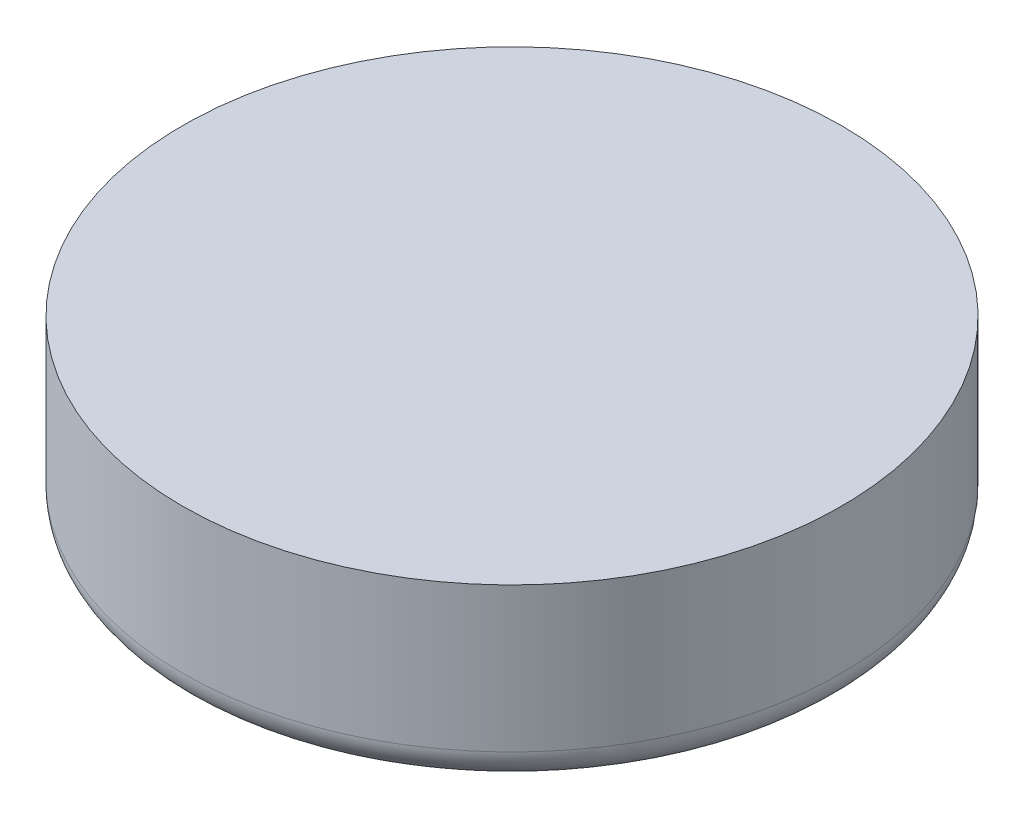
ISO-10303-21;
HEADER;
FILE_DESCRIPTION(('STEP AP214'),'2;1');
FILE_NAME('part.step','',(''),(''),'','','');
FILE_SCHEMA(('AUTOMOTIVE_DESIGN { 1 0 10303 214 1 1 1 1 }'));
ENDSEC;
DATA;
#1=APPLICATION_CONTEXT('core data for automotive mechanical design processes');
#2=APPLICATION_PROTOCOL_DEFINITION('international standard','automotive_design',2000,#1);
#3=PRODUCT_CONTEXT('',#1,'mechanical');
#4=PRODUCT('Part','Part','',(#3));
#5=PRODUCT_RELATED_PRODUCT_CATEGORY('part','',(#4));
#6=PRODUCT_DEFINITION_FORMATION('','',#4);
#7=PRODUCT_DEFINITION_CONTEXT('part definition',#1,'design');
#8=PRODUCT_DEFINITION('design','',#6,#7);
#9=PRODUCT_DEFINITION_SHAPE('','',#8);
#10=(LENGTH_UNIT() NAMED_UNIT(*) SI_UNIT(.MILLI.,.METRE.));
#11=(NAMED_UNIT(*) PLANE_ANGLE_UNIT() SI_UNIT($,.RADIAN.));
#12=(NAMED_UNIT(*) SI_UNIT($,.STERADIAN.) SOLID_ANGLE_UNIT());
#13=UNCERTAINTY_MEASURE_WITH_UNIT(LENGTH_MEASURE(1.E-05),#10,'distance_accuracy_value','');
#14=(GEOMETRIC_REPRESENTATION_CONTEXT(3) GLOBAL_UNCERTAINTY_ASSIGNED_CONTEXT((#13)) GLOBAL_UNIT_ASSIGNED_CONTEXT((#10,
#11,#12)) REPRESENTATION_CONTEXT('',''));
#15=CARTESIAN_POINT('',(0.,0.,0.));
#16=DIRECTION('',(0.,0.,1.));
#17=DIRECTION('',(1.,0.,0.));
#18=AXIS2_PLACEMENT_3D('',#15,#16,#17);
#19=CARTESIAN_POINT('',(0.,1.1,0.));
#20=DIRECTION('',(0.,-1.,0.));
#21=DIRECTION('',(0.,0.,-1.));
#22=AXIS2_PLACEMENT_3D('',#19,#20,#21);
#23=CYLINDRICAL_SURFACE('',#22,2.05);
#24=CARTESIAN_POINT('',(0.,0.2,0.));
#25=DIRECTION('',(0.,1.,0.));
#26=DIRECTION('',(0.,0.,1.));
#27=AXIS2_PLACEMENT_3D('',#24,#25,#26);
#28=CIRCLE('',#27,2.05);
#29=CARTESIAN_POINT('',(0.,0.2,2.05));
#30=VERTEX_POINT('',#29);
#31=EDGE_CURVE('E39',#30,#30,#28,.T.);
#32=ORIENTED_EDGE('',*,*,#31,.T.);
#33=EDGE_LOOP('',(#32));
#34=FACE_BOUND('',#33,.T.);
#35=CARTESIAN_POINT('',(0.,1.1,0.));
#36=DIRECTION('',(0.,1.,0.));
#37=DIRECTION('',(0.,0.,1.));
#38=AXIS2_PLACEMENT_3D('',#35,#36,#37);
#39=CIRCLE('',#38,2.05);
#40=CARTESIAN_POINT('',(0.,1.1,2.05));
#41=VERTEX_POINT('',#40);
#42=EDGE_CURVE('E43',#41,#41,#39,.T.);
#43=ORIENTED_EDGE('',*,*,#42,.F.);
#44=EDGE_LOOP('',(#43));
#45=FACE_BOUND('',#44,.T.);
#46=ADVANCED_FACE('F32',(#34,#45),#23,.T.);
#47=CARTESIAN_POINT('',(0.,1.1,0.));
#48=DIRECTION('',(0.,1.,0.));
#49=DIRECTION('',(0.,0.,1.));
#50=AXIS2_PLACEMENT_3D('',#47,#48,#49);
#51=PLANE('',#50);
#52=ORIENTED_EDGE('',*,*,#42,.T.);
#53=EDGE_LOOP('',(#52));
#54=FACE_BOUND('',#53,.T.);
#55=ADVANCED_FACE('F50',(#54),#51,.T.);
#56=CARTESIAN_POINT('',(0.,0.,0.));
#57=DIRECTION('',(0.,1.,0.));
#58=DIRECTION('',(0.,0.,1.));
#59=AXIS2_PLACEMENT_3D('',#56,#57,#58);
#60=PLANE('',#59);
#61=CARTESIAN_POINT('',(0.,0.,0.));
#62=DIRECTION('',(0.,1.,0.));
#63=DIRECTION('',(0.,0.,1.));
#64=AXIS2_PLACEMENT_3D('',#61,#62,#63);
#65=CIRCLE('',#64,1.85);
#66=CARTESIAN_POINT('',(0.,0.,1.85));
#67=VERTEX_POINT('',#66);
#68=EDGE_CURVE('E10',#67,#67,#65,.F.);
#69=ORIENTED_EDGE('',*,*,#68,.T.);
#70=EDGE_LOOP('',(#69));
#71=FACE_BOUND('',#70,.T.);
#72=ADVANCED_FACE('F56',(#71),#60,.F.);
#73=CARTESIAN_POINT('',(0.,0.2,0.));
#74=DIRECTION('',(0.,1.,0.));
#75=DIRECTION('',(0.,0.,1.));
#76=AXIS2_PLACEMENT_3D('',#73,#74,#75);
#77=TOROIDAL_SURFACE('',#76,1.85,0.2);
#78=ORIENTED_EDGE('',*,*,#68,.F.);
#79=EDGE_LOOP('',(#78));
#80=FACE_BOUND('',#79,.T.);
#81=ORIENTED_EDGE('',*,*,#31,.F.);
#82=EDGE_LOOP('',(#81));
#83=FACE_BOUND('',#82,.T.);
#84=ADVANCED_FACE('F34',(#80,#83),#77,.T.);
#85=CLOSED_SHELL('',(#46,#55,#72,#84));
#86=MANIFOLD_SOLID_BREP('B2',#85);
#87=ADVANCED_BREP_SHAPE_REPRESENTATION('',(#18,#86),#14);
#88=SHAPE_DEFINITION_REPRESENTATION(#9,#87);
ENDSEC;
END-ISO-10303-21;
